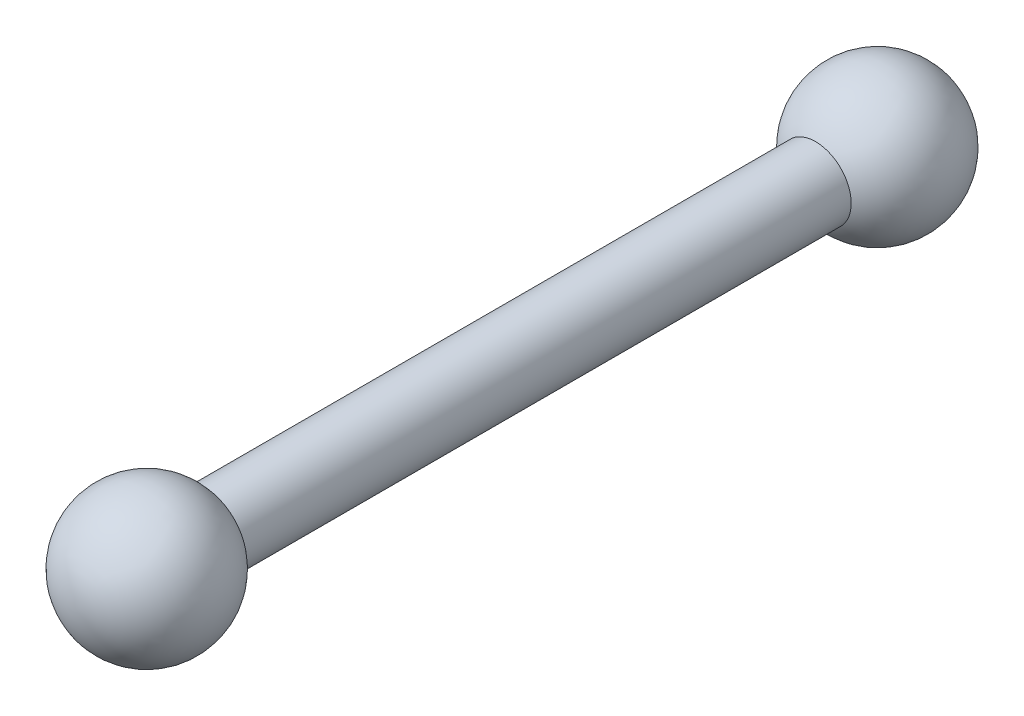
ISO-10303-21;
HEADER;
FILE_DESCRIPTION(('STEP AP214'),'2;1');
FILE_NAME('part.step','',(''),(''),'','','');
FILE_SCHEMA(('AUTOMOTIVE_DESIGN { 1 0 10303 214 1 1 1 1 }'));
ENDSEC;
DATA;
#1=APPLICATION_CONTEXT('core data for automotive mechanical design processes');
#2=APPLICATION_PROTOCOL_DEFINITION('international standard','automotive_design',2000,#1);
#3=PRODUCT_CONTEXT('',#1,'mechanical');
#4=PRODUCT('Part','Part','',(#3));
#5=PRODUCT_RELATED_PRODUCT_CATEGORY('part','',(#4));
#6=PRODUCT_DEFINITION_FORMATION('','',#4);
#7=PRODUCT_DEFINITION_CONTEXT('part definition',#1,'design');
#8=PRODUCT_DEFINITION('design','',#6,#7);
#9=PRODUCT_DEFINITION_SHAPE('','',#8);
#10=(LENGTH_UNIT() NAMED_UNIT(*) SI_UNIT(.MILLI.,.METRE.));
#11=(NAMED_UNIT(*) PLANE_ANGLE_UNIT() SI_UNIT($,.RADIAN.));
#12=(NAMED_UNIT(*) SI_UNIT($,.STERADIAN.) SOLID_ANGLE_UNIT());
#13=UNCERTAINTY_MEASURE_WITH_UNIT(LENGTH_MEASURE(1.E-05),#10,'distance_accuracy_value','');
#14=(GEOMETRIC_REPRESENTATION_CONTEXT(3) GLOBAL_UNCERTAINTY_ASSIGNED_CONTEXT((#13)) GLOBAL_UNIT_ASSIGNED_CONTEXT((#10,
#11,#12)) REPRESENTATION_CONTEXT('',''));
#15=CARTESIAN_POINT('',(0.,0.,0.));
#16=DIRECTION('',(0.,0.,1.));
#17=DIRECTION('',(1.,0.,0.));
#18=AXIS2_PLACEMENT_3D('',#15,#16,#17);
#19=CARTESIAN_POINT('',(0.,0.,-38.));
#20=DIRECTION('',(0.,1.,0.));
#21=DIRECTION('',(1.,0.,0.));
#22=AXIS2_PLACEMENT_3D('',#19,#20,#21);
#23=SPHERICAL_SURFACE('',#22,4.);
#24=CARTESIAN_POINT('',(0.,0.,-38.));
#25=DIRECTION('',(0.,0.,-1.));
#26=DIRECTION('',(-1.,0.,0.));
#27=AXIS2_PLACEMENT_3D('',#24,#25,#26);
#28=SPHERICAL_SURFACE('',#27,4.);
#29=CARTESIAN_POINT('',(0.,0.,-34.5358983848623));
#30=DIRECTION('',(0.,0.,-1.));
#31=DIRECTION('',(-1.,0.,0.));
#32=AXIS2_PLACEMENT_3D('',#29,#30,#31);
#33=CIRCLE('',#32,2.);
#34=CARTESIAN_POINT('',(-2.,0.,-34.5358983848623));
#35=VERTEX_POINT('',#34);
#36=EDGE_CURVE('E41',#35,#35,#33,.F.);
#37=ORIENTED_EDGE('',*,*,#36,.F.);
#38=EDGE_LOOP('',(#37));
#39=FACE_BOUND('',#38,.T.);
#40=ADVANCED_FACE('F37',(#39),#28,.T.);
#41=CARTESIAN_POINT('',(0.,0.,-35.));
#42=DIRECTION('',(0.,0.,1.));
#43=DIRECTION('',(1.,0.,0.));
#44=AXIS2_PLACEMENT_3D('',#41,#42,#43);
#45=CYLINDRICAL_SURFACE('',#44,2.);
#46=CARTESIAN_POINT('',(0.,0.,-0.464101615137752));
#47=DIRECTION('',(0.,0.,1.));
#48=DIRECTION('',(1.,0.,0.));
#49=AXIS2_PLACEMENT_3D('',#46,#47,#48);
#50=CIRCLE('',#49,2.);
#51=CARTESIAN_POINT('',(2.,0.,-0.464101615137752));
#52=VERTEX_POINT('',#51);
#53=EDGE_CURVE('E10',#52,#52,#50,.F.);
#54=ORIENTED_EDGE('',*,*,#53,.T.);
#55=EDGE_LOOP('',(#54));
#56=FACE_BOUND('',#55,.T.);
#57=ORIENTED_EDGE('',*,*,#36,.T.);
#58=EDGE_LOOP('',(#57));
#59=FACE_BOUND('',#58,.T.);
#60=ADVANCED_FACE('F39',(#56,#59),#45,.T.);
#61=CARTESIAN_POINT('',(0.,0.,3.));
#62=DIRECTION('',(0.,1.,0.));
#63=DIRECTION('',(1.,0.,0.));
#64=AXIS2_PLACEMENT_3D('',#61,#62,#63);
#65=SPHERICAL_SURFACE('',#64,4.);
#66=CARTESIAN_POINT('',(0.,0.,3.));
#67=DIRECTION('',(0.,0.,1.));
#68=DIRECTION('',(1.,0.,0.));
#69=AXIS2_PLACEMENT_3D('',#66,#67,#68);
#70=SPHERICAL_SURFACE('',#69,4.);
#71=ORIENTED_EDGE('',*,*,#53,.F.);
#72=EDGE_LOOP('',(#71));
#73=FACE_BOUND('',#72,.T.);
#74=ADVANCED_FACE('F58',(#73),#70,.T.);
#75=CLOSED_SHELL('',(#40,#60,#74));
#76=MANIFOLD_SOLID_BREP('B2',#75);
#77=ADVANCED_BREP_SHAPE_REPRESENTATION('',(#18,#76),#14);
#78=SHAPE_DEFINITION_REPRESENTATION(#9,#77);
ENDSEC;
END-ISO-10303-21;
